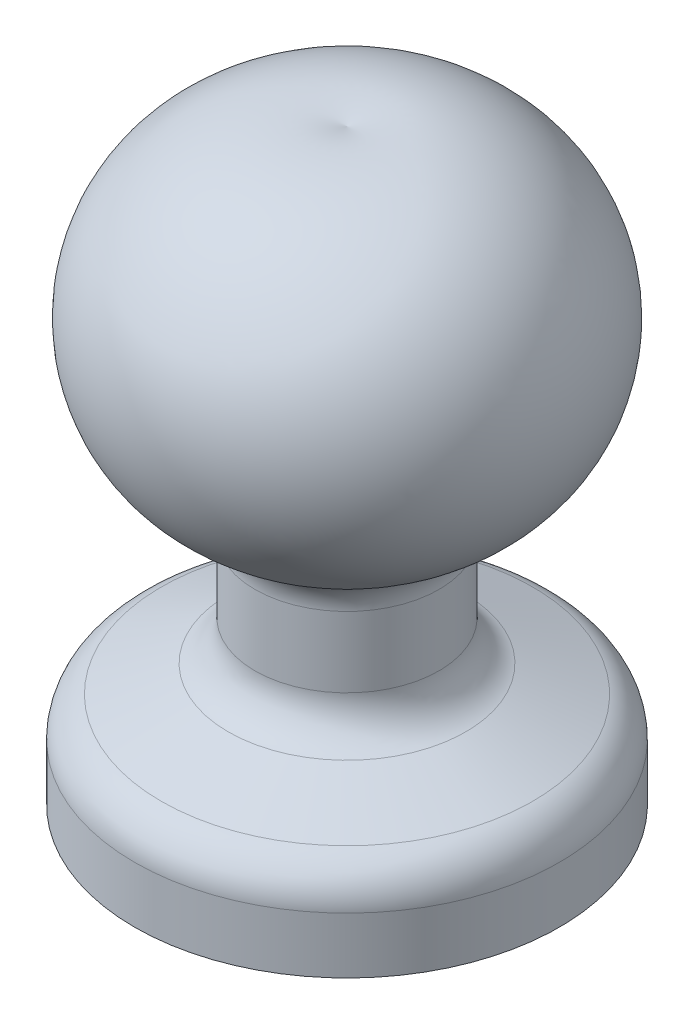
ISO-10303-21;
HEADER;
FILE_DESCRIPTION(('STEP AP214'),'2;1');
FILE_NAME('part.step','',(''),(''),'','','');
FILE_SCHEMA(('AUTOMOTIVE_DESIGN { 1 0 10303 214 1 1 1 1 }'));
ENDSEC;
DATA;
#1=APPLICATION_CONTEXT('core data for automotive mechanical design processes');
#2=APPLICATION_PROTOCOL_DEFINITION('international standard','automotive_design',2000,#1);
#3=PRODUCT_CONTEXT('',#1,'mechanical');
#4=PRODUCT('Part','Part','',(#3));
#5=PRODUCT_RELATED_PRODUCT_CATEGORY('part','',(#4));
#6=PRODUCT_DEFINITION_FORMATION('','',#4);
#7=PRODUCT_DEFINITION_CONTEXT('part definition',#1,'design');
#8=PRODUCT_DEFINITION('design','',#6,#7);
#9=PRODUCT_DEFINITION_SHAPE('','',#8);
#10=(LENGTH_UNIT() NAMED_UNIT(*) SI_UNIT(.MILLI.,.METRE.));
#11=(NAMED_UNIT(*) PLANE_ANGLE_UNIT() SI_UNIT($,.RADIAN.));
#12=(NAMED_UNIT(*) SI_UNIT($,.STERADIAN.) SOLID_ANGLE_UNIT());
#13=UNCERTAINTY_MEASURE_WITH_UNIT(LENGTH_MEASURE(1.E-05),#10,'distance_accuracy_value','');
#14=(GEOMETRIC_REPRESENTATION_CONTEXT(3) GLOBAL_UNCERTAINTY_ASSIGNED_CONTEXT((#13)) GLOBAL_UNIT_ASSIGNED_CONTEXT((#10,
#11,#12)) REPRESENTATION_CONTEXT('',''));
#15=CARTESIAN_POINT('',(0.,0.,0.));
#16=DIRECTION('',(0.,0.,1.));
#17=DIRECTION('',(1.,0.,0.));
#18=AXIS2_PLACEMENT_3D('',#15,#16,#17);
#19=CARTESIAN_POINT('',(0.,-68.0222935878095,0.));
#20=DIRECTION('',(0.,1.,0.));
#21=DIRECTION('',(0.,0.,1.));
#22=AXIS2_PLACEMENT_3D('',#19,#20,#21);
#23=PLANE('',#22);
#24=CARTESIAN_POINT('',(0.,-68.0222935878095,0.));
#25=DIRECTION('',(0.,1.,0.));
#26=DIRECTION('',(0.,0.,1.));
#27=AXIS2_PLACEMENT_3D('',#24,#25,#26);
#28=CIRCLE('',#27,25.);
#29=CARTESIAN_POINT('',(0.,-68.0222935878095,25.));
#30=VERTEX_POINT('',#29);
#31=EDGE_CURVE('E11',#30,#30,#28,.T.);
#32=ORIENTED_EDGE('',*,*,#31,.F.);
#33=EDGE_LOOP('',(#32));
#34=FACE_BOUND('',#33,.T.);
#35=ADVANCED_FACE('F33',(#34),#23,.F.);
#36=CARTESIAN_POINT('',(0.,86.0522991171084,0.));
#37=DIRECTION('',(0.,1.,0.));
#38=DIRECTION('',(0.,0.,1.));
#39=AXIS2_PLACEMENT_3D('',#36,#37,#38);
#40=CYLINDRICAL_SURFACE('',#39,25.);
#41=CARTESIAN_POINT('',(0.,-61.4110819247036,0.));
#42=DIRECTION('',(0.,1.,0.));
#43=DIRECTION('',(0.,0.,1.));
#44=AXIS2_PLACEMENT_3D('',#41,#42,#43);
#45=CIRCLE('',#44,25.);
#46=CARTESIAN_POINT('',(0.,-61.4110819247036,25.));
#47=VERTEX_POINT('',#46);
#48=EDGE_CURVE('E39',#47,#47,#45,.T.);
#49=ORIENTED_EDGE('',*,*,#48,.F.);
#50=EDGE_LOOP('',(#49));
#51=FACE_BOUND('',#50,.T.);
#52=ORIENTED_EDGE('',*,*,#31,.T.);
#53=EDGE_LOOP('',(#52));
#54=FACE_BOUND('',#53,.T.);
#55=ADVANCED_FACE('F69',(#51,#54),#40,.T.);
#56=CARTESIAN_POINT('',(0.,-61.4110819247036,0.));
#57=DIRECTION('',(0.,1.,0.));
#58=DIRECTION('',(0.,0.,1.));
#59=AXIS2_PLACEMENT_3D('',#56,#57,#58);
#60=TOROIDAL_SURFACE('',#59,20.,5.);
#61=CARTESIAN_POINT('',(0.,-56.7668558402641,0.));
#62=DIRECTION('',(0.,1.,0.));
#63=DIRECTION('',(0.,0.,1.));
#64=AXIS2_PLACEMENT_3D('',#61,#62,#63);
#65=CIRCLE('',#64,21.8523401622304);
#66=CARTESIAN_POINT('',(0.,-56.7668558402641,21.8523401622304));
#67=VERTEX_POINT('',#66);
#68=EDGE_CURVE('E62',#67,#67,#65,.T.);
#69=ORIENTED_EDGE('',*,*,#68,.F.);
#70=EDGE_LOOP('',(#69));
#71=FACE_BOUND('',#70,.T.);
#72=ORIENTED_EDGE('',*,*,#48,.T.);
#73=EDGE_LOOP('',(#72));
#74=FACE_BOUND('',#73,.T.);
#75=ADVANCED_FACE('F67',(#71,#74),#60,.T.);
#76=CARTESIAN_POINT('',(0.,-56.7668558402641,0.));
#77=DIRECTION('',(0.,-1.,0.));
#78=DIRECTION('',(0.,0.,-1.));
#79=AXIS2_PLACEMENT_3D('',#76,#77,#78);
#80=CONICAL_SURFACE('',#79,21.8523401622304,1.19128347032995);
#81=CARTESIAN_POINT('',(0.,-53.6260381376519,0.));
#82=DIRECTION('',(0.,1.,0.));
#83=DIRECTION('',(0.,0.,1.));
#84=AXIS2_PLACEMENT_3D('',#81,#82,#83);
#85=CIRCLE('',#84,13.9776161788248);
#86=CARTESIAN_POINT('',(0.,-53.6260381376519,13.9776161788248));
#87=VERTEX_POINT('',#86);
#88=EDGE_CURVE('E59',#87,#87,#85,.T.);
#89=ORIENTED_EDGE('',*,*,#88,.F.);
#90=EDGE_LOOP('',(#89));
#91=FACE_BOUND('',#90,.T.);
#92=ORIENTED_EDGE('',*,*,#68,.T.);
#93=EDGE_LOOP('',(#92));
#94=FACE_BOUND('',#93,.T.);
#95=ADVANCED_FACE('F87',(#91,#94),#80,.T.);
#96=CARTESIAN_POINT('',(0.,-48.9818120532124,0.));
#97=DIRECTION('',(0.,1.,0.));
#98=DIRECTION('',(0.,0.,1.));
#99=AXIS2_PLACEMENT_3D('',#96,#97,#98);
#100=TOROIDAL_SURFACE('',#99,15.8299563410552,5.);
#101=CARTESIAN_POINT('',(0.,-48.9818120532124,0.));
#102=DIRECTION('',(0.,1.,0.));
#103=DIRECTION('',(0.,0.,1.));
#104=AXIS2_PLACEMENT_3D('',#101,#102,#103);
#105=CIRCLE('',#104,10.8299563410552);
#106=CARTESIAN_POINT('',(0.,-48.9818120532124,10.8299563410552));
#107=VERTEX_POINT('',#106);
#108=EDGE_CURVE('E54',#107,#107,#105,.T.);
#109=ORIENTED_EDGE('',*,*,#108,.F.);
#110=EDGE_LOOP('',(#109));
#111=FACE_BOUND('',#110,.T.);
#112=ORIENTED_EDGE('',*,*,#88,.T.);
#113=EDGE_LOOP('',(#112));
#114=FACE_BOUND('',#113,.T.);
#115=ADVANCED_FACE('F95',(#111,#114),#100,.F.);
#116=CARTESIAN_POINT('',(0.,86.0522991171084,0.));
#117=DIRECTION('',(0.,1.,0.));
#118=DIRECTION('',(0.,0.,1.));
#119=AXIS2_PLACEMENT_3D('',#116,#117,#118);
#120=CYLINDRICAL_SURFACE('',#119,10.8299563410552);
#121=CARTESIAN_POINT('',(0.,-40.6879721870767,0.));
#122=DIRECTION('',(0.,1.,0.));
#123=DIRECTION('',(0.,0.,1.));
#124=AXIS2_PLACEMENT_3D('',#121,#122,#123);
#125=CIRCLE('',#124,10.8299563410552);
#126=CARTESIAN_POINT('',(0.,-40.6879721870767,10.8299563410552));
#127=VERTEX_POINT('',#126);
#128=EDGE_CURVE('E51',#127,#127,#125,.T.);
#129=ORIENTED_EDGE('',*,*,#128,.F.);
#130=EDGE_LOOP('',(#129));
#131=FACE_BOUND('',#130,.T.);
#132=ORIENTED_EDGE('',*,*,#108,.T.);
#133=EDGE_LOOP('',(#132));
#134=FACE_BOUND('',#133,.T.);
#135=ADVANCED_FACE('F103',(#131,#134),#120,.T.);
#136=CARTESIAN_POINT('',(0.,-40.6879721870768,0.));
#137=DIRECTION('',(0.,1.,0.));
#138=DIRECTION('',(0.,0.,1.));
#139=AXIS2_PLACEMENT_3D('',#136,#137,#138);
#140=TOROIDAL_SURFACE('',#139,15.8299563410552,5.);
#141=CARTESIAN_POINT('',(0.,-36.2286035069481,0.));
#142=DIRECTION('',(0.,1.,0.));
#143=DIRECTION('',(0.,0.,1.));
#144=AXIS2_PLACEMENT_3D('',#141,#142,#143);
#145=CIRCLE('',#144,13.5685340066188);
#146=CARTESIAN_POINT('',(0.,-36.2286035069481,13.5685340066188));
#147=VERTEX_POINT('',#146);
#148=EDGE_CURVE('E49',#147,#147,#145,.T.);
#149=ORIENTED_EDGE('',*,*,#148,.F.);
#150=EDGE_LOOP('',(#149));
#151=FACE_BOUND('',#150,.T.);
#152=ORIENTED_EDGE('',*,*,#128,.T.);
#153=EDGE_LOOP('',(#152));
#154=FACE_BOUND('',#153,.T.);
#155=ADVANCED_FACE('F45',(#151,#154),#140,.F.);
#156=CARTESIAN_POINT('',(0.,-18.3911287864337,4.52284466887293));
#157=DIRECTION('',(-1.,0.,0.));
#158=DIRECTION('',(0.,0.,1.));
#159=AXIS2_PLACEMENT_3D('',#156,#157,#158);
#160=CIRCLE('',#159,20.);
#161=TRIMMED_CURVE('',#160,(PARAMETER_VALUE(-1.79891181443117)),
(PARAMETER_VALUE(1.79891181443117)),.T.,.PARAMETER.);
#162=CARTESIAN_POINT('',(0.,-18.3911287864337,0.));
#163=DIRECTION('',(0.,1.,0.));
#164=AXIS1_PLACEMENT('',#162,#163);
#165=SURFACE_OF_REVOLUTION('',#161,#164);
#166=CARTESIAN_POINT('',(0.,1.09075705917292,0.));
#167=VERTEX_POINT('',#166);
#168=VERTEX_LOOP('',#167);
#169=FACE_BOUND('',#168,.T.);
#170=ORIENTED_EDGE('',*,*,#148,.T.);
#171=EDGE_LOOP('',(#170));
#172=FACE_BOUND('',#171,.T.);
#173=ADVANCED_FACE('F42',(#169,#172),#165,.T.);
#174=CLOSED_SHELL('',(#35,#55,#75,#95,#115,#135,#155,#173));
#175=MANIFOLD_SOLID_BREP('B2',#174);
#176=ADVANCED_BREP_SHAPE_REPRESENTATION('',(#18,#175),#14);
#177=SHAPE_DEFINITION_REPRESENTATION(#9,#176);
ENDSEC;
END-ISO-10303-21;
